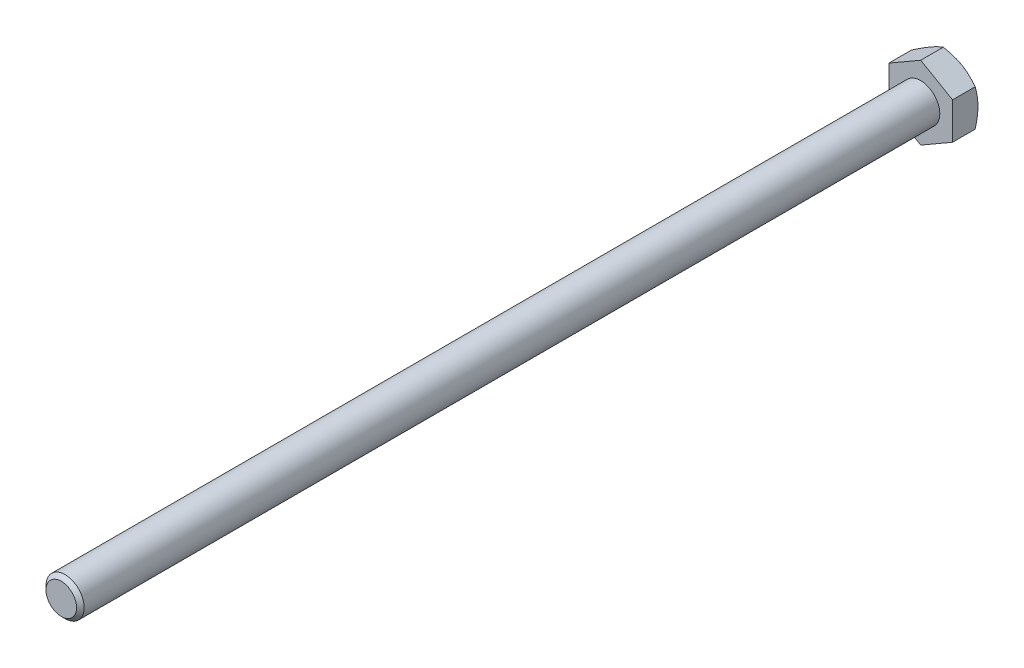
ISO-10303-21;
HEADER;
FILE_DESCRIPTION(('STEP AP214'),'2;1');
FILE_NAME('part.step','',(''),(''),'','','');
FILE_SCHEMA(('AUTOMOTIVE_DESIGN { 1 0 10303 214 1 1 1 1 }'));
ENDSEC;
DATA;
#1=APPLICATION_CONTEXT('core data for automotive mechanical design processes');
#2=APPLICATION_PROTOCOL_DEFINITION('international standard','automotive_design',2000,#1);
#3=PRODUCT_CONTEXT('',#1,'mechanical');
#4=PRODUCT('Part','Part','',(#3));
#5=PRODUCT_RELATED_PRODUCT_CATEGORY('part','',(#4));
#6=PRODUCT_DEFINITION_FORMATION('','',#4);
#7=PRODUCT_DEFINITION_CONTEXT('part definition',#1,'design');
#8=PRODUCT_DEFINITION('design','',#6,#7);
#9=PRODUCT_DEFINITION_SHAPE('','',#8);
#10=(LENGTH_UNIT() NAMED_UNIT(*) SI_UNIT(.MILLI.,.METRE.));
#11=(NAMED_UNIT(*) PLANE_ANGLE_UNIT() SI_UNIT($,.RADIAN.));
#12=(NAMED_UNIT(*) SI_UNIT($,.STERADIAN.) SOLID_ANGLE_UNIT());
#13=UNCERTAINTY_MEASURE_WITH_UNIT(LENGTH_MEASURE(1.E-05),#10,'distance_accuracy_value','');
#14=(GEOMETRIC_REPRESENTATION_CONTEXT(3) GLOBAL_UNCERTAINTY_ASSIGNED_CONTEXT((#13)) GLOBAL_UNIT_ASSIGNED_CONTEXT((#10,
#11,#12)) REPRESENTATION_CONTEXT('',''));
#15=CARTESIAN_POINT('',(0.,0.,0.));
#16=DIRECTION('',(0.,0.,1.));
#17=DIRECTION('',(1.,0.,0.));
#18=AXIS2_PLACEMENT_3D('',#15,#16,#17);
#19=CARTESIAN_POINT('',(0.,0.,135.));
#20=DIRECTION('',(0.,0.,1.));
#21=DIRECTION('',(1.,0.,0.));
#22=AXIS2_PLACEMENT_3D('',#19,#20,#21);
#23=PLANE('',#22);
#24=CARTESIAN_POINT('',(0.,0.,135.));
#25=DIRECTION('',(0.,0.,1.));
#26=DIRECTION('',(1.,0.,0.));
#27=AXIS2_PLACEMENT_3D('',#24,#25,#26);
#28=CIRCLE('',#27,2.40000000000001);
#29=CARTESIAN_POINT('',(2.40000000000003,0.,135.));
#30=VERTEX_POINT('',#29);
#31=EDGE_CURVE('E222',#30,#30,#28,.T.);
#32=ORIENTED_EDGE('',*,*,#31,.T.);
#33=EDGE_LOOP('',(#32));
#34=FACE_BOUND('',#33,.T.);
#35=ADVANCED_FACE('F42',(#34),#23,.T.);
#36=CARTESIAN_POINT('',(0.,0.,0.));
#37=DIRECTION('',(0.,0.,1.));
#38=DIRECTION('',(1.,0.,0.));
#39=AXIS2_PLACEMENT_3D('',#36,#37,#38);
#40=CYLINDRICAL_SURFACE('',#39,3.);
#41=CARTESIAN_POINT('',(0.,0.,134.4));
#42=DIRECTION('',(0.,0.,1.));
#43=DIRECTION('',(1.,0.,0.));
#44=AXIS2_PLACEMENT_3D('',#41,#42,#43);
#45=CIRCLE('',#44,3.);
#46=CARTESIAN_POINT('',(3.00000000000002,0.,134.4));
#47=VERTEX_POINT('',#46);
#48=EDGE_CURVE('E224',#47,#47,#45,.F.);
#49=ORIENTED_EDGE('',*,*,#48,.T.);
#50=EDGE_LOOP('',(#49));
#51=FACE_BOUND('',#50,.T.);
#52=CARTESIAN_POINT('',(0.,0.,0.));
#53=DIRECTION('',(0.,0.,1.));
#54=DIRECTION('',(1.,0.,0.));
#55=AXIS2_PLACEMENT_3D('',#52,#53,#54);
#56=CIRCLE('',#55,3.);
#57=CARTESIAN_POINT('',(3.,0.,0.));
#58=VERTEX_POINT('',#57);
#59=EDGE_CURVE('E225',#58,#58,#56,.F.);
#60=ORIENTED_EDGE('',*,*,#59,.F.);
#61=EDGE_LOOP('',(#60));
#62=FACE_BOUND('',#61,.T.);
#63=ADVANCED_FACE('F213',(#51,#62),#40,.T.);
#64=CARTESIAN_POINT('',(0.,0.,135.));
#65=DIRECTION('',(0.,0.,-1.));
#66=DIRECTION('',(-1.,0.,0.));
#67=AXIS2_PLACEMENT_3D('',#64,#65,#66);
#68=CONICAL_SURFACE('',#67,2.40000000000001,0.78539816339745);
#69=ORIENTED_EDGE('',*,*,#48,.F.);
#70=EDGE_LOOP('',(#69));
#71=FACE_BOUND('',#70,.T.);
#72=ORIENTED_EDGE('',*,*,#31,.F.);
#73=EDGE_LOOP('',(#72));
#74=FACE_BOUND('',#73,.T.);
#75=ADVANCED_FACE('F218',(#71,#74),#68,.T.);
#76=CARTESIAN_POINT('',(0.,5.77350269189627,-4.));
#77=DIRECTION('',(0.499999999999998,0.86602540378444,0.));
#78=DIRECTION('',(-0.86602540378444,0.499999999999998,0.));
#79=AXIS2_PLACEMENT_3D('',#76,#77,#78);
#80=PLANE('',#79);
#81=CARTESIAN_POINT('',(-0.000200000000019629,5.77361816195011,-3.55335134394816));
#82=CARTESIAN_POINT('',(0.219534594525165,5.64675433465072,-3.62661343236236));
#83=CARTESIAN_POINT('',(0.441148584459561,5.51880543790591,-3.6932486780819));
#84=CARTESIAN_POINT('',(0.888213995453495,5.26069210252319,-3.80956100898918));
#85=CARTESIAN_POINT('',(1.11367335959076,5.13052307794722,-3.85919695008421));
#86=CARTESIAN_POINT('',(1.56183230522349,4.87177839004642,-3.9364489745813));
#87=CARTESIAN_POINT('',(1.78446209310418,4.74324302208388,-3.96457962171651));
#88=CARTESIAN_POINT('',(2.11918990184663,4.54998783160118,-3.98980507804631));
#89=CARTESIAN_POINT('',(2.23084219680505,4.48552534905129,-3.99538654023051));
#90=CARTESIAN_POINT('',(2.45424997067378,4.35654081066912,-4.00079778324853));
#91=CARTESIAN_POINT('',(2.5660054462903,4.29201875673852,-4.0006277417418));
#92=CARTESIAN_POINT('',(2.87218423085063,4.11524635305246,-3.99224636820796));
#93=CARTESIAN_POINT('',(3.0665060859672,4.00305457769148,-3.97817022810275));
#94=CARTESIAN_POINT('',(3.4538601019977,3.77941563226459,-3.93353474289057));
#95=CARTESIAN_POINT('',(3.64689090137156,3.6679692482842,-3.90296013985249));
#96=CARTESIAN_POINT('',(4.03502534247485,3.44387972423145,-3.82653150637883));
#97=CARTESIAN_POINT('',(4.23007999864173,3.33126486598681,-3.78035362112132));
#98=CARTESIAN_POINT('',(4.61728034535877,3.10771464157942,-3.67554820550806));
#99=CARTESIAN_POINT('',(4.80943099540809,2.99677641204848,-3.61694529656262));
#100=CARTESIAN_POINT('',(5.0002,2.8866358758943,-3.55335134394817));
#101=B_SPLINE_CURVE_WITH_KNOTS('',3,(#81,#82,#83,#84,#85,#86,#87,#88,#89,#90,#91,#92,#93,#94,
#95,#96,#97,#98,#99,#100),.UNSPECIFIED.,.F.,.F.,(4,2,2,2,2,2,2,2,2,4),(0.,0.792555841363092,
1.58701660053334,2.36181537487281,2.74884076077326,3.13585419177295,3.8096236259968,
4.4840172390119,5.1733688234893,5.86136694793727),.UNSPECIFIED.);
#102=CARTESIAN_POINT('',(0.,5.77350269189627,-3.55341801261479));
#103=VERTEX_POINT('',#102);
#104=CARTESIAN_POINT('',(2.5,4.3301270189222,-4.));
#105=VERTEX_POINT('',#104);
#106=EDGE_CURVE('E258',#103,#105,#101,.T.);
#107=ORIENTED_EDGE('',*,*,#106,.F.);
#108=DIRECTION('',(0.,0.,1.));
#109=VECTOR('',#108,1.);
#110=CARTESIAN_POINT('',(0.,5.77350269189627,-4.));
#111=LINE('',#110,#109);
#112=CARTESIAN_POINT('',(0.,5.77350269189627,0.));
#113=VERTEX_POINT('',#112);
#114=EDGE_CURVE('E232',#103,#113,#111,.T.);
#115=ORIENTED_EDGE('',*,*,#114,.T.);
#116=DIRECTION('',(-0.86602540378444,0.499999999999998,0.));
#117=VECTOR('',#116,1.);
#118=CARTESIAN_POINT('',(0.,5.77350269189627,0.));
#119=LINE('',#118,#117);
#120=CARTESIAN_POINT('',(5.00000000000001,2.88675134594814,0.));
#121=VERTEX_POINT('',#120);
#122=EDGE_CURVE('E256',#121,#113,#119,.T.);
#123=ORIENTED_EDGE('',*,*,#122,.F.);
#124=DIRECTION('',(0.,0.,1.));
#125=VECTOR('',#124,1.);
#126=CARTESIAN_POINT('',(5.00000000000001,2.88675134594814,-4.));
#127=LINE('',#126,#125);
#128=CARTESIAN_POINT('',(5.00000000000001,2.88675134594814,-3.55341801261479));
#129=VERTEX_POINT('',#128);
#130=EDGE_CURVE('E229',#129,#121,#127,.T.);
#131=ORIENTED_EDGE('',*,*,#130,.F.);
#132=EDGE_CURVE('E187',#105,#129,#101,.T.);
#133=ORIENTED_EDGE('',*,*,#132,.F.);
#134=EDGE_LOOP('',(#107,#115,#123,#131,#133));
#135=FACE_BOUND('',#134,.T.);
#136=ADVANCED_FACE('F198',(#135),#80,.T.);
#137=CARTESIAN_POINT('',(5.,-2.88675134594814,-4.));
#138=DIRECTION('',(1.,0.,0.));
#139=DIRECTION('',(0.,0.,-1.));
#140=AXIS2_PLACEMENT_3D('',#137,#138,#139);
#141=PLANE('',#140);
#142=CARTESIAN_POINT('',(5.00000000000003,-7.87365701887672,-1.5017575406002));
#143=CARTESIAN_POINT('',(5.00000000000001,-7.65421637408504,-1.60868091551637));
#144=CARTESIAN_POINT('',(5.00000000000001,-7.4342845863567,-1.71461296428863));
#145=CARTESIAN_POINT('',(5.,-6.99317792778184,-1.92393906972983));
#146=CARTESIAN_POINT('',(5.,-6.77200287775449,-2.0273327484078));
#147=CARTESIAN_POINT('',(5.00000000000001,-6.32706593086419,-2.23152152372063));
#148=CARTESIAN_POINT('',(5.,-6.10329657096097,-2.3323004121857));
#149=CARTESIAN_POINT('',(5.,-5.65401907662694,-2.52988978310133));
#150=CARTESIAN_POINT('',(5.,-5.42851102159107,-2.62670044549485));
#151=CARTESIAN_POINT('',(5.,-4.96773019079148,-2.81850105982912));
#152=CARTESIAN_POINT('',(5.,-4.73238523141453,-2.91331851381281));
#153=CARTESIAN_POINT('',(5.,-4.25898650473721,-3.09606229826895));
#154=CARTESIAN_POINT('',(5.00000000000001,-4.02093244346306,-3.18398787255528));
#155=CARTESIAN_POINT('',(5.,-3.54214478748226,-3.35072723495475));
#156=CARTESIAN_POINT('',(5.,-3.30141732768301,-3.42955846793331));
#157=CARTESIAN_POINT('',(5.00000000000001,-2.81651125773828,-3.57565910984207));
#158=CARTESIAN_POINT('',(5.00000000000002,-2.57233372177782,-3.64293203520484));
#159=CARTESIAN_POINT('',(5.00000000000002,-2.08173956311769,-3.7624103830642));
#160=CARTESIAN_POINT('',(5.00000000000001,-1.83534384469816,-3.81470009598878));
#161=CARTESIAN_POINT('',(5.,-1.33936717869397,-3.90133365164022));
#162=CARTESIAN_POINT('',(5.,-1.08978658051682,-3.93567944591482));
#163=CARTESIAN_POINT('',(5.00000000000001,-0.591994652611089,-3.98324171552745));
#164=CARTESIAN_POINT('',(5.,-0.343810846499266,-3.99673913454035));
#165=CARTESIAN_POINT('',(5.,0.152820514821978,-4.00220795227786));
#166=CARTESIAN_POINT('',(5.,0.401268073866,-3.99417903363378));
#167=CARTESIAN_POINT('',(5.,0.81953961467647,-3.96311999213591));
#168=CARTESIAN_POINT('',(5.,0.989794934045113,-3.94552930521965));
#169=CARTESIAN_POINT('',(5.,1.32912938793637,-3.90127081793362));
#170=CARTESIAN_POINT('',(5.,1.49820837304529,-3.87460188520701));
#171=CARTESIAN_POINT('',(5.,2.00341173301727,-3.78237229170764));
#172=CARTESIAN_POINT('',(5.,2.33733597588798,-3.7046029071478));
#173=CARTESIAN_POINT('',(5.,2.83691487199412,-3.56883106598623));
#174=CARTESIAN_POINT('',(5.,3.00513229800651,-3.51971360302847));
#175=CARTESIAN_POINT('',(5.,3.33993504452563,-3.41615110534968));
#176=CARTESIAN_POINT('',(5.,3.50652035243128,-3.36170602953137));
#177=CARTESIAN_POINT('',(5.,3.83810926585562,-3.24838071200456));
#178=CARTESIAN_POINT('',(5.,4.00311330167853,-3.18950171787468));
#179=CARTESIAN_POINT('',(5.,4.33173746060673,-3.06802383137711));
#180=CARTESIAN_POINT('',(5.,4.49535761540593,-3.00542502446628));
#181=CARTESIAN_POINT('',(5.,4.93598294300641,-2.83201950467008));
#182=CARTESIAN_POINT('',(5.,5.21182602366739,-2.71826266901746));
#183=CARTESIAN_POINT('',(5.,5.76066658468264,-2.48405585630305));
#184=CARTESIAN_POINT('',(5.,6.03366374395565,-2.36360513352739));
#185=CARTESIAN_POINT('',(5.,6.57746623823238,-2.11759609543005));
#186=CARTESIAN_POINT('',(5.,6.84827068606623,-1.99203582558467));
#187=CARTESIAN_POINT('',(5.,7.38802449320272,-1.73703058830432));
#188=CARTESIAN_POINT('',(5.,7.65697392790876,-1.60758577992801));
#189=CARTESIAN_POINT('',(5.,8.19381940264887,-1.34544789623686));
#190=CARTESIAN_POINT('',(5.,8.46171304378484,-1.21274991821137));
#191=CARTESIAN_POINT('',(5.,8.99628800444126,-0.944933092450974));
#192=CARTESIAN_POINT('',(5.,9.26296931379109,-0.809814224453297));
#193=CARTESIAN_POINT('',(5.,10.0614145317377,-0.401627396016993));
#194=CARTESIAN_POINT('',(5.,10.5917004378745,-0.125669691034933));
#195=CARTESIAN_POINT('',(5.,11.5934978261983,0.401869320930909));
#196=CARTESIAN_POINT('',(5.,12.0652823432174,0.652934653119654));
#197=CARTESIAN_POINT('',(5.,13.0072652089827,1.1580917437192));
#198=CARTESIAN_POINT('',(5.,13.4774634574011,1.41218368911637));
#199=CARTESIAN_POINT('',(5.,14.4150598997455,1.92174727964073));
#200=CARTESIAN_POINT('',(5.,14.8824621908533,2.17721139782642));
#201=CARTESIAN_POINT('',(5.00000000000001,15.8162766578094,2.68985606252671));
#202=CARTESIAN_POINT('',(5.00000000000001,16.2826889092875,2.94703647122068));
#203=CARTESIAN_POINT('',(5.00000000000001,16.7487534511426,3.20484156047919));
#204=B_SPLINE_CURVE_WITH_KNOTS('',3,(#142,#143,#144,#145,#146,#147,#148,#149,#150,#151,#152,
#153,#154,#155,#156,#157,#158,#159,#160,#161,#162,#163,#164,#165,#166,#167,#168,#169,#170,#171,
#172,#173,#174,#175,#176,#177,#178,#179,#180,#181,#182,#183,#184,#185,#186,#187,#188,#189,#190,
#191,#192,#193,#194,#195,#196,#197,#198,#199,#200,#201,#202,#203),.UNSPECIFIED.,.F.,.F.,(4,2,2,
2,2,2,2,2,2,2,2,2,2,2,2,2,2,2,2,2,2,2,2,2,2,2,2,2,2,2,4),(0.,0.732320649228782,1.46474969554234,
2.20096737715445,2.93715163726605,3.69825037836022,4.45943251165486,5.2191293658807,
5.97859468349109,6.7336996372194,7.48872245001086,8.23347928786152,8.9782471059268,
9.49148539016024,10.0047877156168,11.0318914624583,11.5575684291884,12.0832494513179,
12.6087831104645,13.1343047009664,14.0293094369911,14.9244140791771,15.819864399481,
16.7152781040304,17.612136124032,18.5090016542186,20.3023290058613,21.9056050637106,
23.5089806922305,25.106957271978,26.7048070399876),.UNSPECIFIED.);
#205=CARTESIAN_POINT('',(5.00000000000003,0.,-4.));
#206=VERTEX_POINT('',#205);
#207=EDGE_CURVE('E185',#129,#206,#204,.F.);
#208=ORIENTED_EDGE('',*,*,#207,.F.);
#209=ORIENTED_EDGE('',*,*,#130,.T.);
#210=DIRECTION('',(0.,1.,0.));
#211=VECTOR('',#210,1.);
#212=CARTESIAN_POINT('',(5.,-2.88675134594814,0.));
#213=LINE('',#212,#211);
#214=CARTESIAN_POINT('',(5.,-2.88675134594814,0.));
#215=VERTEX_POINT('',#214);
#216=EDGE_CURVE('E234',#215,#121,#213,.T.);
#217=ORIENTED_EDGE('',*,*,#216,.F.);
#218=DIRECTION('',(0.,0.,1.));
#219=VECTOR('',#218,1.);
#220=CARTESIAN_POINT('',(5.,-2.88675134594814,-4.));
#221=LINE('',#220,#219);
#222=CARTESIAN_POINT('',(5.,-2.88675134594814,-3.55341801261479));
#223=VERTEX_POINT('',#222);
#224=EDGE_CURVE('E240',#223,#215,#221,.T.);
#225=ORIENTED_EDGE('',*,*,#224,.F.);
#226=EDGE_CURVE('E179',#206,#223,#204,.F.);
#227=ORIENTED_EDGE('',*,*,#226,.F.);
#228=EDGE_LOOP('',(#208,#209,#217,#225,#227));
#229=FACE_BOUND('',#228,.T.);
#230=ADVANCED_FACE('F194',(#229),#141,.T.);
#231=CARTESIAN_POINT('',(0.,-5.77350269189626,-4.));
#232=DIRECTION('',(0.499999999999998,-0.86602540378444,0.));
#233=DIRECTION('',(0.86602540378444,0.499999999999998,0.));
#234=AXIS2_PLACEMENT_3D('',#231,#232,#233);
#235=PLANE('',#234);
#236=CARTESIAN_POINT('',(5.0002,-2.8866358758943,-3.55335134394816));
#237=CARTESIAN_POINT('',(4.78046540547482,-3.01349970319369,-3.62661343236236));
#238=CARTESIAN_POINT('',(4.55885141554042,-3.1414485999385,-3.6932486780819));
#239=CARTESIAN_POINT('',(4.11178600454649,-3.39956193532121,-3.80956100898919));
#240=CARTESIAN_POINT('',(3.88632664040923,-3.52973095989718,-3.85919695008421));
#241=CARTESIAN_POINT('',(3.43816769477649,-3.78847564779798,-3.9364489745813));
#242=CARTESIAN_POINT('',(3.21553790689581,-3.91701101576052,-3.96457962171651));
#243=CARTESIAN_POINT('',(2.88081009815336,-4.11026620624322,-3.98980507804632));
#244=CARTESIAN_POINT('',(2.76915780319494,-4.17472868879311,-3.99538654023052));
#245=CARTESIAN_POINT('',(2.54575002932621,-4.30371322717528,-4.00079778324853));
#246=CARTESIAN_POINT('',(2.4339945537097,-4.36823528110589,-4.0006277417418));
#247=CARTESIAN_POINT('',(2.12781576914937,-4.54500768479196,-3.99224636820796));
#248=CARTESIAN_POINT('',(1.93349391403279,-4.65719946015293,-3.97817022810275));
#249=CARTESIAN_POINT('',(1.54613989800229,-4.88083840557981,-3.93353474289057));
#250=CARTESIAN_POINT('',(1.35310909862842,-4.9922847895602,-3.90296013985249));
#251=CARTESIAN_POINT('',(0.964974657525134,-5.21637431361295,-3.82653150637884));
#252=CARTESIAN_POINT('',(0.76992000135825,-5.32898917185759,-3.78035362112132));
#253=CARTESIAN_POINT('',(0.382719654641213,-5.55253939626499,-3.67554820550806));
#254=CARTESIAN_POINT('',(0.190569004591893,-5.66347762579592,-3.61694529656262));
#255=CARTESIAN_POINT('',(-0.000200000000019629,-5.77361816195011,-3.55335134394816));
#256=B_SPLINE_CURVE_WITH_KNOTS('',3,(#236,#237,#238,#239,#240,#241,#242,#243,#244,#245,#246,
#247,#248,#249,#250,#251,#252,#253,#254,#255),.UNSPECIFIED.,.F.,.F.,(4,2,2,2,2,2,2,2,2,4),(0.,
0.792555841363089,1.58701660053333,2.3618153748728,2.74884076077325,3.13585419177294,
3.80962362599679,4.4840172390119,5.1733688234893,5.86136694793727),.UNSPECIFIED.);
#257=CARTESIAN_POINT('',(2.5,-4.33012701892221,-4.));
#258=VERTEX_POINT('',#257);
#259=EDGE_CURVE('E186',#223,#258,#256,.T.);
#260=ORIENTED_EDGE('',*,*,#259,.F.);
#261=ORIENTED_EDGE('',*,*,#224,.T.);
#262=DIRECTION('',(0.86602540378444,0.499999999999998,0.));
#263=VECTOR('',#262,1.);
#264=CARTESIAN_POINT('',(0.,-5.77350269189626,0.));
#265=LINE('',#264,#263);
#266=CARTESIAN_POINT('',(0.,-5.77350269189626,0.));
#267=VERTEX_POINT('',#266);
#268=EDGE_CURVE('E245',#267,#215,#265,.T.);
#269=ORIENTED_EDGE('',*,*,#268,.F.);
#270=DIRECTION('',(0.,0.,1.));
#271=VECTOR('',#270,1.);
#272=CARTESIAN_POINT('',(0.,-5.77350269189626,-4.));
#273=LINE('',#272,#271);
#274=CARTESIAN_POINT('',(0.,-5.77350269189626,-3.55341801261479));
#275=VERTEX_POINT('',#274);
#276=EDGE_CURVE('E238',#275,#267,#273,.T.);
#277=ORIENTED_EDGE('',*,*,#276,.F.);
#278=EDGE_CURVE('E172',#258,#275,#256,.T.);
#279=ORIENTED_EDGE('',*,*,#278,.F.);
#280=EDGE_LOOP('',(#260,#261,#269,#277,#279));
#281=FACE_BOUND('',#280,.T.);
#282=ADVANCED_FACE('F197',(#281),#235,.T.);
#283=CARTESIAN_POINT('',(0.,-5.77350269189626,-4.));
#284=DIRECTION('',(-0.500000000000001,-0.866025403784438,0.));
#285=DIRECTION('',(0.866025403784438,-0.500000000000001,0.));
#286=AXIS2_PLACEMENT_3D('',#283,#284,#285);
#287=PLANE('',#286);
#288=CARTESIAN_POINT('',(0.00020000000001269,-5.77361816195013,-3.55335134394816));
#289=CARTESIAN_POINT('',(-0.219534594525175,-5.64675433465073,-3.62661343236236));
#290=CARTESIAN_POINT('',(-0.441148584459573,-5.51880543790592,-3.6932486780819));
#291=CARTESIAN_POINT('',(-0.888213995453512,-5.26069210252319,-3.80956100898918));
#292=CARTESIAN_POINT('',(-1.11367335959078,-5.13052307794722,-3.8591969500842));
#293=CARTESIAN_POINT('',(-1.56183230522352,-4.87177839004642,-3.9364489745813));
#294=CARTESIAN_POINT('',(-1.78446209310421,-4.74324302208387,-3.96457962171651));
#295=CARTESIAN_POINT('',(-2.11918990184666,-4.54998783160116,-3.98980507804631));
#296=CARTESIAN_POINT('',(-2.23084219680508,-4.48552534905128,-3.99538654023051));
#297=CARTESIAN_POINT('',(-2.45424997067382,-4.35654081066911,-4.00079778324853));
#298=CARTESIAN_POINT('',(-2.56600544629034,-4.2920187567385,-4.00062774174179));
#299=CARTESIAN_POINT('',(-2.87218423085067,-4.11524635305245,-3.99224636820795));
#300=CARTESIAN_POINT('',(-3.06650608596724,-4.00305457769146,-3.97817022810274));
#301=CARTESIAN_POINT('',(-3.45386010199772,-3.77941563226457,-3.93353474289057));
#302=CARTESIAN_POINT('',(-3.64689090137158,-3.66796924828419,-3.90296013985249));
#303=CARTESIAN_POINT('',(-4.03502534247486,-3.44387972423144,-3.82653150637883));
#304=CARTESIAN_POINT('',(-4.23007999864174,-3.33126486598681,-3.78035362112132));
#305=CARTESIAN_POINT('',(-4.61728034535876,-3.10771464157941,-3.67554820550806));
#306=CARTESIAN_POINT('',(-4.80943099540808,-2.99677641204848,-3.61694529656262));
#307=CARTESIAN_POINT('',(-5.00019999999999,-2.8866358758943,-3.55335134394817));
#308=B_SPLINE_CURVE_WITH_KNOTS('',3,(#288,#289,#290,#291,#292,#293,#294,#295,#296,#297,#298,
#299,#300,#301,#302,#303,#304,#305,#306,#307),.UNSPECIFIED.,.F.,.F.,(4,2,2,2,2,2,2,2,2,4),(0.,
0.792555841363104,1.58701660053336,2.36181537487284,2.7488407607733,3.135854191773,
3.80962362599683,4.48401723901192,5.17336882348931,5.86136694793727),.UNSPECIFIED.);
#309=CARTESIAN_POINT('',(-2.49999999999997,-4.33012701892221,-4.));
#310=VERTEX_POINT('',#309);
#311=EDGE_CURVE('E277',#275,#310,#308,.T.);
#312=ORIENTED_EDGE('',*,*,#311,.F.);
#313=ORIENTED_EDGE('',*,*,#276,.T.);
#314=DIRECTION('',(0.866025403784438,-0.500000000000001,0.));
#315=VECTOR('',#314,1.);
#316=CARTESIAN_POINT('',(0.,-5.77350269189626,0.));
#317=LINE('',#316,#315);
#318=CARTESIAN_POINT('',(-5.,-2.88675134594814,0.));
#319=VERTEX_POINT('',#318);
#320=EDGE_CURVE('E248',#319,#267,#317,.T.);
#321=ORIENTED_EDGE('',*,*,#320,.F.);
#322=DIRECTION('',(0.,0.,1.));
#323=VECTOR('',#322,1.);
#324=CARTESIAN_POINT('',(-5.,-2.88675134594814,-4.));
#325=LINE('',#324,#323);
#326=CARTESIAN_POINT('',(-5.,-2.88675134594837,-3.55341801261495));
#327=VERTEX_POINT('',#326);
#328=EDGE_CURVE('E236',#327,#319,#325,.T.);
#329=ORIENTED_EDGE('',*,*,#328,.F.);
#330=EDGE_CURVE('E118',#310,#327,#308,.T.);
#331=ORIENTED_EDGE('',*,*,#330,.F.);
#332=EDGE_LOOP('',(#312,#313,#321,#329,#331));
#333=FACE_BOUND('',#332,.T.);
#334=ADVANCED_FACE('F202',(#333),#287,.T.);
#335=CARTESIAN_POINT('',(-5.,-2.88675134594814,-4.));
#336=DIRECTION('',(-1.,0.,0.));
#337=DIRECTION('',(0.,0.,1.));
#338=AXIS2_PLACEMENT_3D('',#335,#336,#337);
#339=PLANE('',#338);
#340=CARTESIAN_POINT('',(-4.99999999999998,-7.87365701887672,-1.5017575406002));
#341=CARTESIAN_POINT('',(-5.,-7.65421637408504,-1.60868091551637));
#342=CARTESIAN_POINT('',(-5.,-7.43428458635669,-1.71461296428863));
#343=CARTESIAN_POINT('',(-5.00000000000001,-6.99317792778184,-1.92393906972983));
#344=CARTESIAN_POINT('',(-5.00000000000001,-6.77200287775448,-2.0273327484078));
#345=CARTESIAN_POINT('',(-5.,-6.32706593086419,-2.23152152372063));
#346=CARTESIAN_POINT('',(-5.,-6.10329657096097,-2.3323004121857));
#347=CARTESIAN_POINT('',(-5.,-5.65401907662693,-2.52988978310134));
#348=CARTESIAN_POINT('',(-5.,-5.42851102159106,-2.62670044549485));
#349=CARTESIAN_POINT('',(-5.,-4.96773019079146,-2.81850105982912));
#350=CARTESIAN_POINT('',(-5.,-4.73238523141452,-2.91331851381281));
#351=CARTESIAN_POINT('',(-5.,-4.2589865047372,-3.09606229826896));
#352=CARTESIAN_POINT('',(-5.,-4.02093244346305,-3.18398787255528));
#353=CARTESIAN_POINT('',(-5.00000000000001,-3.54214478748225,-3.35072723495475));
#354=CARTESIAN_POINT('',(-5.00000000000001,-3.301417327683,-3.42955846793331));
#355=CARTESIAN_POINT('',(-5.,-2.81651125773827,-3.57565910984207));
#356=CARTESIAN_POINT('',(-4.99999999999999,-2.57233372177781,-3.64293203520484));
#357=CARTESIAN_POINT('',(-4.99999999999999,-2.08173956311767,-3.7624103830642));
#358=CARTESIAN_POINT('',(-5.,-1.83534384469815,-3.81470009598878));
#359=CARTESIAN_POINT('',(-5.00000000000001,-1.33936717869396,-3.90133365164022));
#360=CARTESIAN_POINT('',(-5.00000000000001,-1.08978658051681,-3.93567944591482));
#361=CARTESIAN_POINT('',(-5.,-0.591994652611083,-3.98324171552744));
#362=CARTESIAN_POINT('',(-5.,-0.343810846499262,-3.99673913454035));
#363=CARTESIAN_POINT('',(-5.,0.15282051482198,-4.00220795227786));
#364=CARTESIAN_POINT('',(-5.,0.401268073866001,-3.99417903363377));
#365=CARTESIAN_POINT('',(-5.,0.81953961467647,-3.96311999213591));
#366=CARTESIAN_POINT('',(-5.,0.989794934045113,-3.94552930521965));
#367=CARTESIAN_POINT('',(-5.,1.32912938793637,-3.90127081793362));
#368=CARTESIAN_POINT('',(-5.,1.49820837304529,-3.87460188520701));
#369=CARTESIAN_POINT('',(-5.,2.00341173301727,-3.78237229170764));
#370=CARTESIAN_POINT('',(-5.,2.33733597588798,-3.7046029071478));
#371=CARTESIAN_POINT('',(-5.,2.83691487199412,-3.56883106598623));
#372=CARTESIAN_POINT('',(-5.,3.00513229800651,-3.51971360302847));
#373=CARTESIAN_POINT('',(-5.,3.33993504452563,-3.41615110534968));
#374=CARTESIAN_POINT('',(-5.,3.50652035243127,-3.36170602953137));
#375=CARTESIAN_POINT('',(-5.,3.83810926585562,-3.24838071200456));
#376=CARTESIAN_POINT('',(-5.00000000000001,4.00311330167853,-3.18950171787468));
#377=CARTESIAN_POINT('',(-5.,4.33173746060673,-3.06802383137711));
#378=CARTESIAN_POINT('',(-5.,4.49535761540593,-3.00542502446628));
#379=CARTESIAN_POINT('',(-5.,4.93598294300641,-2.83201950467008));
#380=CARTESIAN_POINT('',(-5.,5.21182602366739,-2.71826266901746));
#381=CARTESIAN_POINT('',(-5.00000000000001,5.76066658468264,-2.48405585630304));
#382=CARTESIAN_POINT('',(-5.00000000000001,6.03366374395565,-2.36360513352739));
#383=CARTESIAN_POINT('',(-5.,6.57746623823238,-2.11759609543005));
#384=CARTESIAN_POINT('',(-5.,6.84827068606624,-1.99203582558467));
#385=CARTESIAN_POINT('',(-5.,7.38802449320272,-1.73703058830432));
#386=CARTESIAN_POINT('',(-5.,7.65697392790876,-1.60758577992801));
#387=CARTESIAN_POINT('',(-5.,8.19381940264887,-1.34544789623686));
#388=CARTESIAN_POINT('',(-5.,8.46171304378484,-1.21274991821136));
#389=CARTESIAN_POINT('',(-5.,8.99628800444126,-0.944933092450973));
#390=CARTESIAN_POINT('',(-5.,9.26296931379109,-0.809814224453294));
#391=CARTESIAN_POINT('',(-5.,10.0614145317377,-0.401627396016988));
#392=CARTESIAN_POINT('',(-5.,10.5917004378745,-0.125669691034929));
#393=CARTESIAN_POINT('',(-5.,11.5934978261983,0.401869320930912));
#394=CARTESIAN_POINT('',(-5.,12.0652823432174,0.652934653119656));
#395=CARTESIAN_POINT('',(-5.,13.0072652089827,1.15809174371921));
#396=CARTESIAN_POINT('',(-5.,13.4774634574011,1.41218368911637));
#397=CARTESIAN_POINT('',(-5.,14.4150598997455,1.92174727964073));
#398=CARTESIAN_POINT('',(-5.00000000000001,14.8824621908533,2.17721139782642));
#399=CARTESIAN_POINT('',(-5.,15.8162766578094,2.68985606252671));
#400=CARTESIAN_POINT('',(-5.,16.2826889092875,2.94703647122068));
#401=CARTESIAN_POINT('',(-5.,16.7487534511426,3.20484156047919));
#402=B_SPLINE_CURVE_WITH_KNOTS('',3,(#340,#341,#342,#343,#344,#345,#346,#347,#348,#349,#350,
#351,#352,#353,#354,#355,#356,#357,#358,#359,#360,#361,#362,#363,#364,#365,#366,#367,#368,#369,
#370,#371,#372,#373,#374,#375,#376,#377,#378,#379,#380,#381,#382,#383,#384,#385,#386,#387,#388,
#389,#390,#391,#392,#393,#394,#395,#396,#397,#398,#399,#400,#401),.UNSPECIFIED.,.F.,.F.,(4,2,2,
2,2,2,2,2,2,2,2,2,2,2,2,2,2,2,2,2,2,2,2,2,2,2,2,2,2,2,4),(0.,0.732320649228784,1.46474969554234,
2.20096737715446,2.93715163726606,3.69825037836022,4.45943251165487,5.21912936588071,
5.9785946834911,6.7336996372194,7.48872245001086,8.23347928786151,8.97824710592679,
9.49148539016024,10.0047877156168,11.0318914624583,11.5575684291884,12.0832494513179,
12.6087831104645,13.1343047009664,14.0293094369911,14.9244140791771,15.819864399481,
16.7152781040304,17.612136124032,18.5090016542186,20.3023290058613,21.9056050637106,
23.5089806922305,25.106957271978,26.7048070399876),.UNSPECIFIED.);
#403=CARTESIAN_POINT('',(-5.,0.,-4.));
#404=VERTEX_POINT('',#403);
#405=EDGE_CURVE('E113',#327,#404,#402,.T.);
#406=ORIENTED_EDGE('',*,*,#405,.F.);
#407=ORIENTED_EDGE('',*,*,#328,.T.);
#408=DIRECTION('',(0.,-1.,0.));
#409=VECTOR('',#408,1.);
#410=CARTESIAN_POINT('',(-5.,-2.88675134594814,0.));
#411=LINE('',#410,#409);
#412=CARTESIAN_POINT('',(-5.,2.88675134594813,0.));
#413=VERTEX_POINT('',#412);
#414=EDGE_CURVE('E251',#413,#319,#411,.T.);
#415=ORIENTED_EDGE('',*,*,#414,.F.);
#416=DIRECTION('',(0.,0.,1.));
#417=VECTOR('',#416,1.);
#418=CARTESIAN_POINT('',(-5.,2.88675134594813,-4.));
#419=LINE('',#418,#417);
#420=CARTESIAN_POINT('',(-5.,2.88675134594813,-3.55341801261479));
#421=VERTEX_POINT('',#420);
#422=EDGE_CURVE('E139',#421,#413,#419,.T.);
#423=ORIENTED_EDGE('',*,*,#422,.F.);
#424=EDGE_CURVE('E122',#404,#421,#402,.T.);
#425=ORIENTED_EDGE('',*,*,#424,.F.);
#426=EDGE_LOOP('',(#406,#407,#415,#423,#425));
#427=FACE_BOUND('',#426,.T.);
#428=ADVANCED_FACE('F137',(#427),#339,.T.);
#429=CARTESIAN_POINT('',(-5.,2.88675134594813,-4.));
#430=DIRECTION('',(-0.500000000000002,0.866025403784438,0.));
#431=DIRECTION('',(-0.866025403784438,-0.500000000000002,0.));
#432=AXIS2_PLACEMENT_3D('',#429,#430,#431);
#433=PLANE('',#432);
#434=CARTESIAN_POINT('',(-5.00019999999999,2.8866358758943,-3.55335134394816));
#435=CARTESIAN_POINT('',(-4.78046540547481,3.01349970319369,-3.62661343236236));
#436=CARTESIAN_POINT('',(-4.55885141554041,3.1414485999385,-3.69324867808191));
#437=CARTESIAN_POINT('',(-4.11178600454648,3.39956193532122,-3.80956100898919));
#438=CARTESIAN_POINT('',(-3.88632664040922,3.52973095989719,-3.85919695008421));
#439=CARTESIAN_POINT('',(-3.43816769477648,3.78847564779799,-3.9364489745813));
#440=CARTESIAN_POINT('',(-3.2155379068958,3.91701101576053,-3.96457962171651));
#441=CARTESIAN_POINT('',(-2.88081009815335,4.11026620624324,-3.98980507804631));
#442=CARTESIAN_POINT('',(-2.76915780319493,4.17472868879312,-3.99538654023051));
#443=CARTESIAN_POINT('',(-2.5457500293262,4.30371322717529,-4.00079778324853));
#444=CARTESIAN_POINT('',(-2.43399455370968,4.3682352811059,-4.00062774174179));
#445=CARTESIAN_POINT('',(-2.12781576914936,4.54500768479196,-3.99224636820795));
#446=CARTESIAN_POINT('',(-1.93349391403279,4.65719946015294,-3.97817022810274));
#447=CARTESIAN_POINT('',(-1.5461398980023,4.88083840557982,-3.93353474289057));
#448=CARTESIAN_POINT('',(-1.35310909862843,4.99228478956021,-3.90296013985249));
#449=CARTESIAN_POINT('',(-0.964974657525154,5.21637431361296,-3.82653150637883));
#450=CARTESIAN_POINT('',(-0.769920001358275,5.32898917185759,-3.78035362112131));
#451=CARTESIAN_POINT('',(-0.382719654641246,5.55253939626499,-3.67554820550806));
#452=CARTESIAN_POINT('',(-0.190569004591931,5.66347762579593,-3.61694529656262));
#453=CARTESIAN_POINT('',(0.000199999999977996,5.77361816195011,-3.55335134394816));
#454=B_SPLINE_CURVE_WITH_KNOTS('',3,(#434,#435,#436,#437,#438,#439,#440,#441,#442,#443,#444,
#445,#446,#447,#448,#449,#450,#451,#452,#453),.UNSPECIFIED.,.F.,.F.,(4,2,2,2,2,2,2,2,2,4),(0.,
0.79255584136309,1.58701660053333,2.3618153748728,2.74884076077325,3.13585419177295,
3.80962362599678,4.48401723901188,5.17336882348927,5.86136694793723),.UNSPECIFIED.);
#455=CARTESIAN_POINT('',(-2.50000000000001,4.3301270189222,-4.));
#456=VERTEX_POINT('',#455);
#457=EDGE_CURVE('E128',#421,#456,#454,.T.);
#458=ORIENTED_EDGE('',*,*,#457,.F.);
#459=ORIENTED_EDGE('',*,*,#422,.T.);
#460=DIRECTION('',(-0.866025403784438,-0.500000000000002,0.));
#461=VECTOR('',#460,1.);
#462=CARTESIAN_POINT('',(-5.,2.88675134594813,0.));
#463=LINE('',#462,#461);
#464=EDGE_CURVE('E254',#113,#413,#463,.T.);
#465=ORIENTED_EDGE('',*,*,#464,.F.);
#466=ORIENTED_EDGE('',*,*,#114,.F.);
#467=EDGE_CURVE('E130',#456,#103,#454,.T.);
#468=ORIENTED_EDGE('',*,*,#467,.F.);
#469=EDGE_LOOP('',(#458,#459,#465,#466,#468));
#470=FACE_BOUND('',#469,.T.);
#471=ADVANCED_FACE('F210',(#470),#433,.T.);
#472=CARTESIAN_POINT('',(5.00000000000001,2.88675134594814,0.));
#473=DIRECTION('',(0.,0.,1.));
#474=DIRECTION('',(1.,0.,0.));
#475=AXIS2_PLACEMENT_3D('',#472,#473,#474);
#476=PLANE('',#475);
#477=ORIENTED_EDGE('',*,*,#59,.T.);
#478=EDGE_LOOP('',(#477));
#479=FACE_BOUND('',#478,.T.);
#480=ORIENTED_EDGE('',*,*,#122,.T.);
#481=ORIENTED_EDGE('',*,*,#464,.T.);
#482=ORIENTED_EDGE('',*,*,#414,.T.);
#483=ORIENTED_EDGE('',*,*,#320,.T.);
#484=ORIENTED_EDGE('',*,*,#268,.T.);
#485=ORIENTED_EDGE('',*,*,#216,.T.);
#486=EDGE_LOOP('',(#480,#481,#482,#483,#484,#485));
#487=FACE_BOUND('',#486,.T.);
#488=ADVANCED_FACE('F164',(#479,#487),#476,.T.);
#489=CARTESIAN_POINT('',(0.,0.,0.));
#490=DIRECTION('',(0.,0.,1.));
#491=DIRECTION('',(1.,0.,0.));
#492=AXIS2_PLACEMENT_3D('',#489,#490,#491);
#493=CONICAL_SURFACE('',#492,11.9282032302755,1.0471975511966);
#494=ORIENTED_EDGE('',*,*,#132,.T.);
#495=ORIENTED_EDGE('',*,*,#207,.T.);
#496=CARTESIAN_POINT('',(0.,0.,-4.));
#497=DIRECTION('',(0.,0.,1.));
#498=DIRECTION('',(1.,0.,0.));
#499=AXIS2_PLACEMENT_3D('',#496,#497,#498);
#500=CIRCLE('',#499,5.);
#501=EDGE_CURVE('E45',#105,#206,#500,.F.);
#502=ORIENTED_EDGE('',*,*,#501,.F.);
#503=EDGE_LOOP('',(#494,#495,#502));
#504=FACE_BOUND('',#503,.T.);
#505=ADVANCED_FACE('F267',(#504),#493,.T.);
#506=ORIENTED_EDGE('',*,*,#106,.T.);
#507=EDGE_CURVE('E135',#456,#105,#500,.F.);
#508=ORIENTED_EDGE('',*,*,#507,.F.);
#509=ORIENTED_EDGE('',*,*,#467,.T.);
#510=EDGE_LOOP('',(#506,#508,#509));
#511=FACE_BOUND('',#510,.T.);
#512=ADVANCED_FACE('F163',(#511),#493,.T.);
#513=ORIENTED_EDGE('',*,*,#424,.T.);
#514=ORIENTED_EDGE('',*,*,#457,.T.);
#515=CARTESIAN_POINT('',(0.,0.,-4.));
#516=DIRECTION('',(0.,0.,-1.));
#517=DIRECTION('',(-1.,0.,0.));
#518=AXIS2_PLACEMENT_3D('',#515,#516,#517);
#519=CIRCLE('',#518,5.);
#520=EDGE_CURVE('E63',#404,#456,#519,.T.);
#521=ORIENTED_EDGE('',*,*,#520,.F.);
#522=EDGE_LOOP('',(#513,#514,#521));
#523=FACE_BOUND('',#522,.T.);
#524=ADVANCED_FACE('F126',(#523),#493,.T.);
#525=ORIENTED_EDGE('',*,*,#330,.T.);
#526=ORIENTED_EDGE('',*,*,#405,.T.);
#527=EDGE_CURVE('E115',#310,#404,#500,.F.);
#528=ORIENTED_EDGE('',*,*,#527,.F.);
#529=EDGE_LOOP('',(#525,#526,#528));
#530=FACE_BOUND('',#529,.T.);
#531=ADVANCED_FACE('F114',(#530),#493,.T.);
#532=ORIENTED_EDGE('',*,*,#278,.T.);
#533=ORIENTED_EDGE('',*,*,#311,.T.);
#534=EDGE_CURVE('E50',#258,#310,#500,.F.);
#535=ORIENTED_EDGE('',*,*,#534,.F.);
#536=EDGE_LOOP('',(#532,#533,#535));
#537=FACE_BOUND('',#536,.T.);
#538=ADVANCED_FACE('F279',(#537),#493,.T.);
#539=ORIENTED_EDGE('',*,*,#226,.T.);
#540=ORIENTED_EDGE('',*,*,#259,.T.);
#541=EDGE_CURVE('E11',#206,#258,#500,.F.);
#542=ORIENTED_EDGE('',*,*,#541,.F.);
#543=EDGE_LOOP('',(#539,#540,#542));
#544=FACE_BOUND('',#543,.T.);
#545=ADVANCED_FACE('F274',(#544),#493,.T.);
#546=CARTESIAN_POINT('',(5.00000000000001,2.88675134594814,-4.));
#547=DIRECTION('',(0.,0.,1.));
#548=DIRECTION('',(1.,0.,0.));
#549=AXIS2_PLACEMENT_3D('',#546,#547,#548);
#550=PLANE('',#549);
#551=ORIENTED_EDGE('',*,*,#501,.T.);
#552=ORIENTED_EDGE('',*,*,#541,.T.);
#553=ORIENTED_EDGE('',*,*,#534,.T.);
#554=ORIENTED_EDGE('',*,*,#527,.T.);
#555=ORIENTED_EDGE('',*,*,#520,.T.);
#556=ORIENTED_EDGE('',*,*,#507,.T.);
#557=EDGE_LOOP('',(#551,#552,#553,#554,#555,#556));
#558=FACE_BOUND('',#557,.T.);
#559=ADVANCED_FACE('F133',(#558),#550,.F.);
#560=CLOSED_SHELL('',(#35,#63,#75,#136,#230,#282,#334,#428,#471,#488,#505,#512,#524,#531,#538,
#545,#559));
#561=MANIFOLD_SOLID_BREP('B2',#560);
#562=ADVANCED_BREP_SHAPE_REPRESENTATION('',(#18,#561),#14);
#563=SHAPE_DEFINITION_REPRESENTATION(#9,#562);
ENDSEC;
END-ISO-10303-21;
